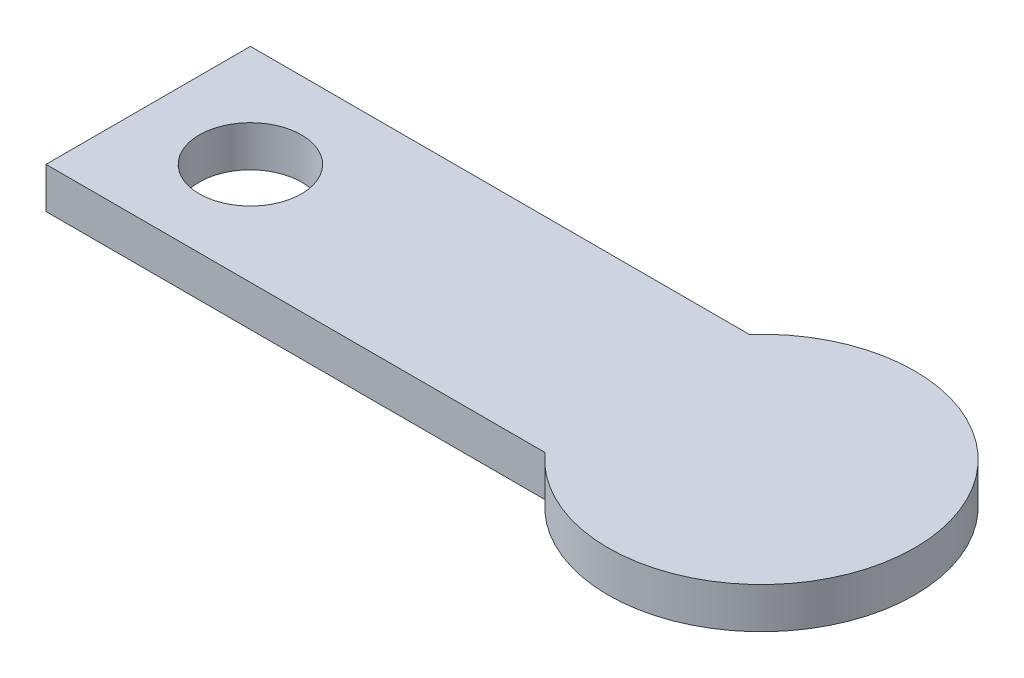
ISO-10303-21;
HEADER;
FILE_DESCRIPTION(('STEP AP214'),'2;1');
FILE_NAME('part.step','',(''),(''),'','','');
FILE_SCHEMA(('AUTOMOTIVE_DESIGN { 1 0 10303 214 1 1 1 1 }'));
ENDSEC;
DATA;
#1=APPLICATION_CONTEXT('core data for automotive mechanical design processes');
#2=APPLICATION_PROTOCOL_DEFINITION('international standard','automotive_design',2000,#1);
#3=PRODUCT_CONTEXT('',#1,'mechanical');
#4=PRODUCT('Part','Part','',(#3));
#5=PRODUCT_RELATED_PRODUCT_CATEGORY('part','',(#4));
#6=PRODUCT_DEFINITION_FORMATION('','',#4);
#7=PRODUCT_DEFINITION_CONTEXT('part definition',#1,'design');
#8=PRODUCT_DEFINITION('design','',#6,#7);
#9=PRODUCT_DEFINITION_SHAPE('','',#8);
#10=(LENGTH_UNIT() NAMED_UNIT(*) SI_UNIT(.MILLI.,.METRE.));
#11=(NAMED_UNIT(*) PLANE_ANGLE_UNIT() SI_UNIT($,.RADIAN.));
#12=(NAMED_UNIT(*) SI_UNIT($,.STERADIAN.) SOLID_ANGLE_UNIT());
#13=UNCERTAINTY_MEASURE_WITH_UNIT(LENGTH_MEASURE(1.E-05),#10,'distance_accuracy_value','');
#14=(GEOMETRIC_REPRESENTATION_CONTEXT(3) GLOBAL_UNCERTAINTY_ASSIGNED_CONTEXT((#13)) GLOBAL_UNIT_ASSIGNED_CONTEXT((#10,
#11,#12)) REPRESENTATION_CONTEXT('',''));
#15=CARTESIAN_POINT('',(0.,0.,0.));
#16=DIRECTION('',(0.,0.,1.));
#17=DIRECTION('',(1.,0.,0.));
#18=AXIS2_PLACEMENT_3D('',#15,#16,#17);
#19=CARTESIAN_POINT('',(0.,2.54,0.));
#20=DIRECTION('',(0.,-1.,0.));
#21=DIRECTION('',(0.,0.,-1.));
#22=AXIS2_PLACEMENT_3D('',#19,#20,#21);
#23=CYLINDRICAL_SURFACE('',#22,9.525);
#24=CARTESIAN_POINT('',(0.,0.,0.));
#25=DIRECTION('',(0.,1.,0.));
#26=DIRECTION('',(0.,0.,1.));
#27=AXIS2_PLACEMENT_3D('',#24,#25,#26);
#28=CIRCLE('',#27,9.525);
#29=CARTESIAN_POINT('',(-7.09951582856183,0.,6.35));
#30=VERTEX_POINT('',#29);
#31=CARTESIAN_POINT('',(-7.09951582856183,0.,-6.35));
#32=VERTEX_POINT('',#31);
#33=EDGE_CURVE('E103',#30,#32,#28,.T.);
#34=ORIENTED_EDGE('',*,*,#33,.T.);
#35=DIRECTION('',(0.,-1.,0.));
#36=VECTOR('',#35,1.);
#37=CARTESIAN_POINT('',(-7.09951582856183,2.54,-6.35));
#38=LINE('',#37,#36);
#39=CARTESIAN_POINT('',(-7.09951582856183,2.54,-6.35));
#40=VERTEX_POINT('',#39);
#41=EDGE_CURVE('E11',#40,#32,#38,.T.);
#42=ORIENTED_EDGE('',*,*,#41,.F.);
#43=CARTESIAN_POINT('',(0.,2.54,0.));
#44=DIRECTION('',(0.,1.,0.));
#45=DIRECTION('',(0.,0.,1.));
#46=AXIS2_PLACEMENT_3D('',#43,#44,#45);
#47=CIRCLE('',#46,9.525);
#48=CARTESIAN_POINT('',(-7.09951582856183,2.54,6.35));
#49=VERTEX_POINT('',#48);
#50=EDGE_CURVE('E88',#49,#40,#47,.T.);
#51=ORIENTED_EDGE('',*,*,#50,.F.);
#52=DIRECTION('',(0.,-1.,0.));
#53=VECTOR('',#52,1.);
#54=CARTESIAN_POINT('',(-7.09951582856183,2.54,6.35));
#55=LINE('',#54,#53);
#56=EDGE_CURVE('E102',#49,#30,#55,.T.);
#57=ORIENTED_EDGE('',*,*,#56,.T.);
#58=EDGE_LOOP('',(#34,#42,#51,#57));
#59=FACE_BOUND('',#58,.T.);
#60=ADVANCED_FACE('F36',(#59),#23,.T.);
#61=CARTESIAN_POINT('',(0.,2.54,-6.35));
#62=DIRECTION('',(0.,0.,1.));
#63=DIRECTION('',(1.,0.,0.));
#64=AXIS2_PLACEMENT_3D('',#61,#62,#63);
#65=PLANE('',#64);
#66=DIRECTION('',(-1.,0.,0.));
#67=VECTOR('',#66,1.);
#68=CARTESIAN_POINT('',(0.,0.,-6.35));
#69=LINE('',#68,#67);
#70=CARTESIAN_POINT('',(-38.1,0.,-6.35));
#71=VERTEX_POINT('',#70);
#72=EDGE_CURVE('E92',#32,#71,#69,.T.);
#73=ORIENTED_EDGE('',*,*,#72,.T.);
#74=DIRECTION('',(0.,-1.,0.));
#75=VECTOR('',#74,1.);
#76=CARTESIAN_POINT('',(-38.1,2.54,-6.35));
#77=LINE('',#76,#75);
#78=CARTESIAN_POINT('',(-38.1,2.54,-6.35));
#79=VERTEX_POINT('',#78);
#80=EDGE_CURVE('E44',#79,#71,#77,.T.);
#81=ORIENTED_EDGE('',*,*,#80,.F.);
#82=DIRECTION('',(-1.,0.,0.));
#83=VECTOR('',#82,1.);
#84=CARTESIAN_POINT('',(0.,2.54,-6.35));
#85=LINE('',#84,#83);
#86=EDGE_CURVE('E82',#40,#79,#85,.T.);
#87=ORIENTED_EDGE('',*,*,#86,.F.);
#88=ORIENTED_EDGE('',*,*,#41,.T.);
#89=EDGE_LOOP('',(#73,#81,#87,#88));
#90=FACE_BOUND('',#89,.T.);
#91=ADVANCED_FACE('F91',(#90),#65,.F.);
#92=CARTESIAN_POINT('',(-38.1,2.54,0.));
#93=DIRECTION('',(1.,0.,0.));
#94=DIRECTION('',(0.,0.,-1.));
#95=AXIS2_PLACEMENT_3D('',#92,#93,#94);
#96=PLANE('',#95);
#97=DIRECTION('',(0.,0.,1.));
#98=VECTOR('',#97,1.);
#99=CARTESIAN_POINT('',(-38.1,0.,0.));
#100=LINE('',#99,#98);
#101=CARTESIAN_POINT('',(-38.1,0.,6.35));
#102=VERTEX_POINT('',#101);
#103=EDGE_CURVE('E69',#71,#102,#100,.T.);
#104=ORIENTED_EDGE('',*,*,#103,.T.);
#105=DIRECTION('',(0.,-1.,0.));
#106=VECTOR('',#105,1.);
#107=CARTESIAN_POINT('',(-38.1,2.54,6.35));
#108=LINE('',#107,#106);
#109=CARTESIAN_POINT('',(-38.1,2.54,6.35));
#110=VERTEX_POINT('',#109);
#111=EDGE_CURVE('E93',#110,#102,#108,.T.);
#112=ORIENTED_EDGE('',*,*,#111,.F.);
#113=DIRECTION('',(0.,0.,1.));
#114=VECTOR('',#113,1.);
#115=CARTESIAN_POINT('',(-38.1,2.54,0.));
#116=LINE('',#115,#114);
#117=EDGE_CURVE('E86',#79,#110,#116,.T.);
#118=ORIENTED_EDGE('',*,*,#117,.F.);
#119=ORIENTED_EDGE('',*,*,#80,.T.);
#120=EDGE_LOOP('',(#104,#112,#118,#119));
#121=FACE_BOUND('',#120,.T.);
#122=ADVANCED_FACE('F94',(#121),#96,.F.);
#123=CARTESIAN_POINT('',(0.,2.54,6.35));
#124=DIRECTION('',(0.,0.,-1.));
#125=DIRECTION('',(-1.,0.,0.));
#126=AXIS2_PLACEMENT_3D('',#123,#124,#125);
#127=PLANE('',#126);
#128=DIRECTION('',(1.,0.,0.));
#129=VECTOR('',#128,1.);
#130=CARTESIAN_POINT('',(0.,0.,6.35));
#131=LINE('',#130,#129);
#132=EDGE_CURVE('E75',#102,#30,#131,.T.);
#133=ORIENTED_EDGE('',*,*,#132,.T.);
#134=ORIENTED_EDGE('',*,*,#56,.F.);
#135=DIRECTION('',(1.,0.,0.));
#136=VECTOR('',#135,1.);
#137=CARTESIAN_POINT('',(0.,2.54,6.35));
#138=LINE('',#137,#136);
#139=EDGE_CURVE('E52',#110,#49,#138,.T.);
#140=ORIENTED_EDGE('',*,*,#139,.F.);
#141=ORIENTED_EDGE('',*,*,#111,.T.);
#142=EDGE_LOOP('',(#133,#134,#140,#141));
#143=FACE_BOUND('',#142,.T.);
#144=ADVANCED_FACE('F113',(#143),#127,.F.);
#145=CARTESIAN_POINT('',(-31.75,2.54,0.));
#146=DIRECTION('',(0.,-1.,0.));
#147=DIRECTION('',(0.,0.,-1.));
#148=AXIS2_PLACEMENT_3D('',#145,#146,#147);
#149=CYLINDRICAL_SURFACE('',#148,3.175);
#150=CARTESIAN_POINT('',(-31.75,2.54,0.));
#151=DIRECTION('',(0.,1.,0.));
#152=DIRECTION('',(0.,0.,1.));
#153=AXIS2_PLACEMENT_3D('',#150,#151,#152);
#154=CIRCLE('',#153,3.175);
#155=CARTESIAN_POINT('',(-31.75,2.54,3.175));
#156=VERTEX_POINT('',#155);
#157=EDGE_CURVE('E96',#156,#156,#154,.T.);
#158=ORIENTED_EDGE('',*,*,#157,.T.);
#159=EDGE_LOOP('',(#158));
#160=FACE_BOUND('',#159,.T.);
#161=CARTESIAN_POINT('',(-31.75,0.,0.));
#162=DIRECTION('',(0.,1.,0.));
#163=DIRECTION('',(0.,0.,1.));
#164=AXIS2_PLACEMENT_3D('',#161,#162,#163);
#165=CIRCLE('',#164,3.175);
#166=CARTESIAN_POINT('',(-31.75,0.,3.175));
#167=VERTEX_POINT('',#166);
#168=EDGE_CURVE('E109',#167,#167,#165,.T.);
#169=ORIENTED_EDGE('',*,*,#168,.F.);
#170=EDGE_LOOP('',(#169));
#171=FACE_BOUND('',#170,.T.);
#172=ADVANCED_FACE('F130',(#160,#171),#149,.F.);
#173=CARTESIAN_POINT('',(0.,2.54,0.));
#174=DIRECTION('',(0.,1.,0.));
#175=DIRECTION('',(0.,0.,1.));
#176=AXIS2_PLACEMENT_3D('',#173,#174,#175);
#177=PLANE('',#176);
#178=ORIENTED_EDGE('',*,*,#50,.T.);
#179=ORIENTED_EDGE('',*,*,#86,.T.);
#180=ORIENTED_EDGE('',*,*,#117,.T.);
#181=ORIENTED_EDGE('',*,*,#139,.T.);
#182=EDGE_LOOP('',(#178,#179,#180,#181));
#183=FACE_BOUND('',#182,.T.);
#184=ORIENTED_EDGE('',*,*,#157,.F.);
#185=EDGE_LOOP('',(#184));
#186=FACE_BOUND('',#185,.T.);
#187=ADVANCED_FACE('F83',(#183,#186),#177,.T.);
#188=CARTESIAN_POINT('',(0.,0.,0.));
#189=DIRECTION('',(0.,1.,0.));
#190=DIRECTION('',(0.,0.,1.));
#191=AXIS2_PLACEMENT_3D('',#188,#189,#190);
#192=PLANE('',#191);
#193=ORIENTED_EDGE('',*,*,#33,.F.);
#194=ORIENTED_EDGE('',*,*,#132,.F.);
#195=ORIENTED_EDGE('',*,*,#103,.F.);
#196=ORIENTED_EDGE('',*,*,#72,.F.);
#197=EDGE_LOOP('',(#193,#194,#195,#196));
#198=FACE_BOUND('',#197,.T.);
#199=ORIENTED_EDGE('',*,*,#168,.T.);
#200=EDGE_LOOP('',(#199));
#201=FACE_BOUND('',#200,.T.);
#202=ADVANCED_FACE('F116',(#198,#201),#192,.F.);
#203=CLOSED_SHELL('',(#60,#91,#122,#144,#172,#187,#202));
#204=MANIFOLD_SOLID_BREP('B2',#203);
#205=ADVANCED_BREP_SHAPE_REPRESENTATION('',(#18,#204),#14);
#206=SHAPE_DEFINITION_REPRESENTATION(#9,#205);
ENDSEC;
END-ISO-10303-21;
